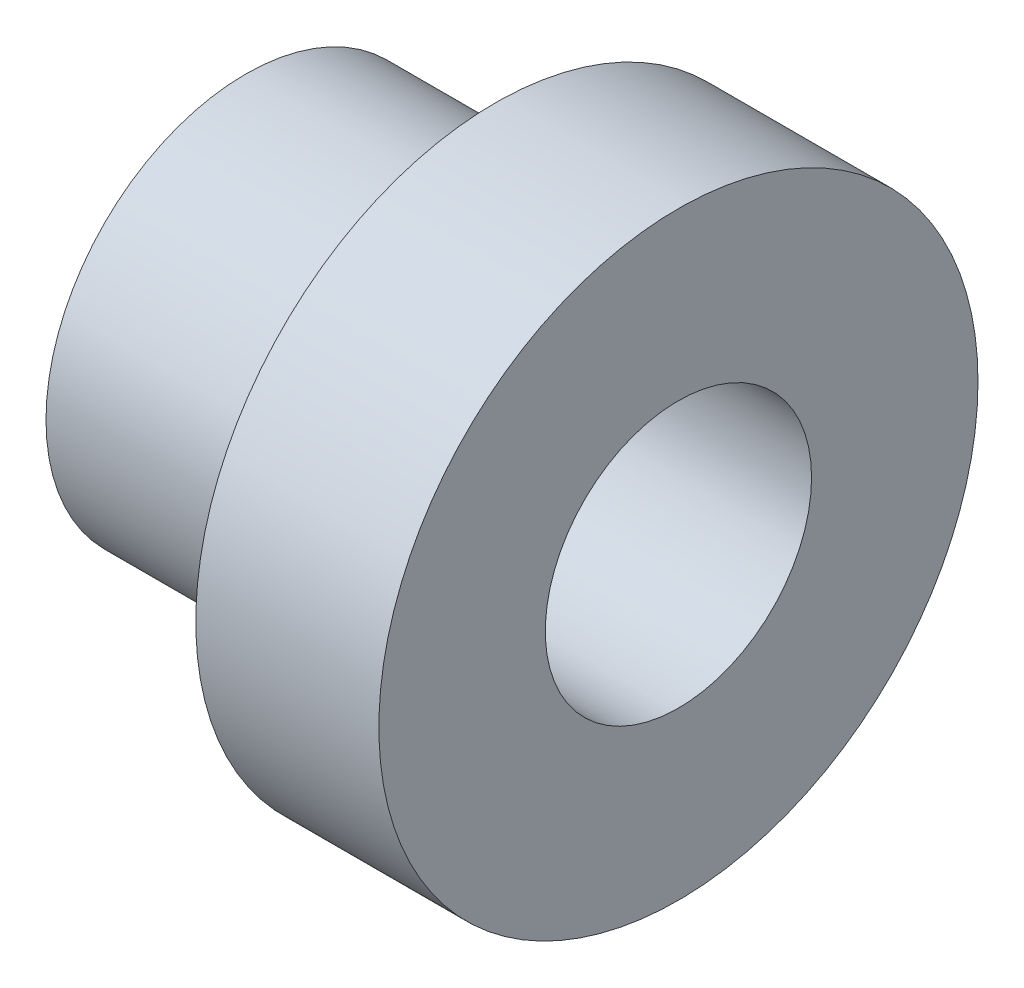
ISO-10303-21;
HEADER;
FILE_DESCRIPTION(('STEP AP214'),'2;1');
FILE_NAME('part.step','',(''),(''),'','','');
FILE_SCHEMA(('AUTOMOTIVE_DESIGN { 1 0 10303 214 1 1 1 1 }'));
ENDSEC;
DATA;
#1=APPLICATION_CONTEXT('core data for automotive mechanical design processes');
#2=APPLICATION_PROTOCOL_DEFINITION('international standard','automotive_design',2000,#1);
#3=PRODUCT_CONTEXT('',#1,'mechanical');
#4=PRODUCT('Part','Part','',(#3));
#5=PRODUCT_RELATED_PRODUCT_CATEGORY('part','',(#4));
#6=PRODUCT_DEFINITION_FORMATION('','',#4);
#7=PRODUCT_DEFINITION_CONTEXT('part definition',#1,'design');
#8=PRODUCT_DEFINITION('design','',#6,#7);
#9=PRODUCT_DEFINITION_SHAPE('','',#8);
#10=(LENGTH_UNIT() NAMED_UNIT(*) SI_UNIT(.MILLI.,.METRE.));
#11=(NAMED_UNIT(*) PLANE_ANGLE_UNIT() SI_UNIT($,.RADIAN.));
#12=(NAMED_UNIT(*) SI_UNIT($,.STERADIAN.) SOLID_ANGLE_UNIT());
#13=UNCERTAINTY_MEASURE_WITH_UNIT(LENGTH_MEASURE(1.E-05),#10,'distance_accuracy_value','');
#14=(GEOMETRIC_REPRESENTATION_CONTEXT(3) GLOBAL_UNCERTAINTY_ASSIGNED_CONTEXT((#13)) GLOBAL_UNIT_ASSIGNED_CONTEXT((#10,
#11,#12)) REPRESENTATION_CONTEXT('',''));
#15=CARTESIAN_POINT('',(0.,0.,0.));
#16=DIRECTION('',(0.,0.,1.));
#17=DIRECTION('',(1.,0.,0.));
#18=AXIS2_PLACEMENT_3D('',#15,#16,#17);
#19=CARTESIAN_POINT('',(0.,0.,0.));
#20=DIRECTION('',(1.,0.,0.));
#21=DIRECTION('',(0.,0.,-1.));
#22=AXIS2_PLACEMENT_3D('',#19,#20,#21);
#23=CYLINDRICAL_SURFACE('',#22,9.);
#24=CARTESIAN_POINT('',(-5.5,0.,0.));
#25=DIRECTION('',(1.,0.,0.));
#26=DIRECTION('',(0.,0.,-1.));
#27=AXIS2_PLACEMENT_3D('',#24,#25,#26);
#28=CIRCLE('',#27,9.);
#29=CARTESIAN_POINT('',(-5.5,0.,-9.));
#30=VERTEX_POINT('',#29);
#31=EDGE_CURVE('E10',#30,#30,#28,.T.);
#32=ORIENTED_EDGE('',*,*,#31,.T.);
#33=EDGE_LOOP('',(#32));
#34=FACE_BOUND('',#33,.T.);
#35=CARTESIAN_POINT('',(0.,0.,0.));
#36=DIRECTION('',(1.,0.,0.));
#37=DIRECTION('',(0.,0.,-1.));
#38=AXIS2_PLACEMENT_3D('',#35,#36,#37);
#39=CIRCLE('',#38,9.);
#40=CARTESIAN_POINT('',(0.,0.,-9.));
#41=VERTEX_POINT('',#40);
#42=EDGE_CURVE('E54',#41,#41,#39,.T.);
#43=ORIENTED_EDGE('',*,*,#42,.F.);
#44=EDGE_LOOP('',(#43));
#45=FACE_BOUND('',#44,.T.);
#46=ADVANCED_FACE('F32',(#34,#45),#23,.T.);
#47=CARTESIAN_POINT('',(-5.5,9.,0.));
#48=DIRECTION('',(-1.,0.,0.));
#49=DIRECTION('',(0.,0.,1.));
#50=AXIS2_PLACEMENT_3D('',#47,#48,#49);
#51=PLANE('',#50);
#52=CARTESIAN_POINT('',(-5.5,0.,0.));
#53=DIRECTION('',(1.,0.,0.));
#54=DIRECTION('',(0.,0.,-1.));
#55=AXIS2_PLACEMENT_3D('',#52,#53,#54);
#56=CIRCLE('',#55,6.);
#57=CARTESIAN_POINT('',(-5.5,0.,-6.));
#58=VERTEX_POINT('',#57);
#59=EDGE_CURVE('E38',#58,#58,#56,.T.);
#60=ORIENTED_EDGE('',*,*,#59,.T.);
#61=EDGE_LOOP('',(#60));
#62=FACE_BOUND('',#61,.T.);
#63=ORIENTED_EDGE('',*,*,#31,.F.);
#64=EDGE_LOOP('',(#63));
#65=FACE_BOUND('',#64,.T.);
#66=ADVANCED_FACE('F62',(#62,#65),#51,.T.);
#67=CARTESIAN_POINT('',(0.,0.,0.));
#68=DIRECTION('',(1.,0.,0.));
#69=DIRECTION('',(0.,0.,-1.));
#70=AXIS2_PLACEMENT_3D('',#67,#68,#69);
#71=CYLINDRICAL_SURFACE('',#70,6.);
#72=CARTESIAN_POINT('',(-13.,0.,0.));
#73=DIRECTION('',(1.,0.,0.));
#74=DIRECTION('',(0.,0.,-1.));
#75=AXIS2_PLACEMENT_3D('',#72,#73,#74);
#76=CIRCLE('',#75,6.);
#77=CARTESIAN_POINT('',(-13.,0.,-6.));
#78=VERTEX_POINT('',#77);
#79=EDGE_CURVE('E42',#78,#78,#76,.T.);
#80=ORIENTED_EDGE('',*,*,#79,.T.);
#81=EDGE_LOOP('',(#80));
#82=FACE_BOUND('',#81,.T.);
#83=ORIENTED_EDGE('',*,*,#59,.F.);
#84=EDGE_LOOP('',(#83));
#85=FACE_BOUND('',#84,.T.);
#86=ADVANCED_FACE('F66',(#82,#85),#71,.T.);
#87=CARTESIAN_POINT('',(-13.,6.,0.));
#88=DIRECTION('',(-1.,0.,0.));
#89=DIRECTION('',(0.,0.,1.));
#90=AXIS2_PLACEMENT_3D('',#87,#88,#89);
#91=PLANE('',#90);
#92=CARTESIAN_POINT('',(-13.,0.,0.));
#93=DIRECTION('',(1.,0.,0.));
#94=DIRECTION('',(0.,0.,-1.));
#95=AXIS2_PLACEMENT_3D('',#92,#93,#94);
#96=CIRCLE('',#95,4.);
#97=CARTESIAN_POINT('',(-13.,0.,-4.));
#98=VERTEX_POINT('',#97);
#99=EDGE_CURVE('E46',#98,#98,#96,.T.);
#100=ORIENTED_EDGE('',*,*,#99,.T.);
#101=EDGE_LOOP('',(#100));
#102=FACE_BOUND('',#101,.T.);
#103=ORIENTED_EDGE('',*,*,#79,.F.);
#104=EDGE_LOOP('',(#103));
#105=FACE_BOUND('',#104,.T.);
#106=ADVANCED_FACE('F70',(#102,#105),#91,.T.);
#107=CARTESIAN_POINT('',(0.,0.,0.));
#108=DIRECTION('',(1.,0.,0.));
#109=DIRECTION('',(0.,0.,-1.));
#110=AXIS2_PLACEMENT_3D('',#107,#108,#109);
#111=CYLINDRICAL_SURFACE('',#110,4.);
#112=CARTESIAN_POINT('',(0.,0.,0.));
#113=DIRECTION('',(1.,0.,0.));
#114=DIRECTION('',(0.,0.,-1.));
#115=AXIS2_PLACEMENT_3D('',#112,#113,#114);
#116=CIRCLE('',#115,4.);
#117=CARTESIAN_POINT('',(0.,0.,-4.));
#118=VERTEX_POINT('',#117);
#119=EDGE_CURVE('E51',#118,#118,#116,.T.);
#120=ORIENTED_EDGE('',*,*,#119,.T.);
#121=EDGE_LOOP('',(#120));
#122=FACE_BOUND('',#121,.T.);
#123=ORIENTED_EDGE('',*,*,#99,.F.);
#124=EDGE_LOOP('',(#123));
#125=FACE_BOUND('',#124,.T.);
#126=ADVANCED_FACE('F77',(#122,#125),#111,.F.);
#127=CARTESIAN_POINT('',(0.,4.,0.));
#128=DIRECTION('',(1.,0.,0.));
#129=DIRECTION('',(0.,0.,-1.));
#130=AXIS2_PLACEMENT_3D('',#127,#128,#129);
#131=PLANE('',#130);
#132=ORIENTED_EDGE('',*,*,#42,.T.);
#133=EDGE_LOOP('',(#132));
#134=FACE_BOUND('',#133,.T.);
#135=ORIENTED_EDGE('',*,*,#119,.F.);
#136=EDGE_LOOP('',(#135));
#137=FACE_BOUND('',#136,.T.);
#138=ADVANCED_FACE('F58',(#134,#137),#131,.T.);
#139=CLOSED_SHELL('',(#46,#66,#86,#106,#126,#138));
#140=MANIFOLD_SOLID_BREP('B2',#139);
#141=ADVANCED_BREP_SHAPE_REPRESENTATION('',(#18,#140),#14);
#142=SHAPE_DEFINITION_REPRESENTATION(#9,#141);
ENDSEC;
END-ISO-10303-21;
